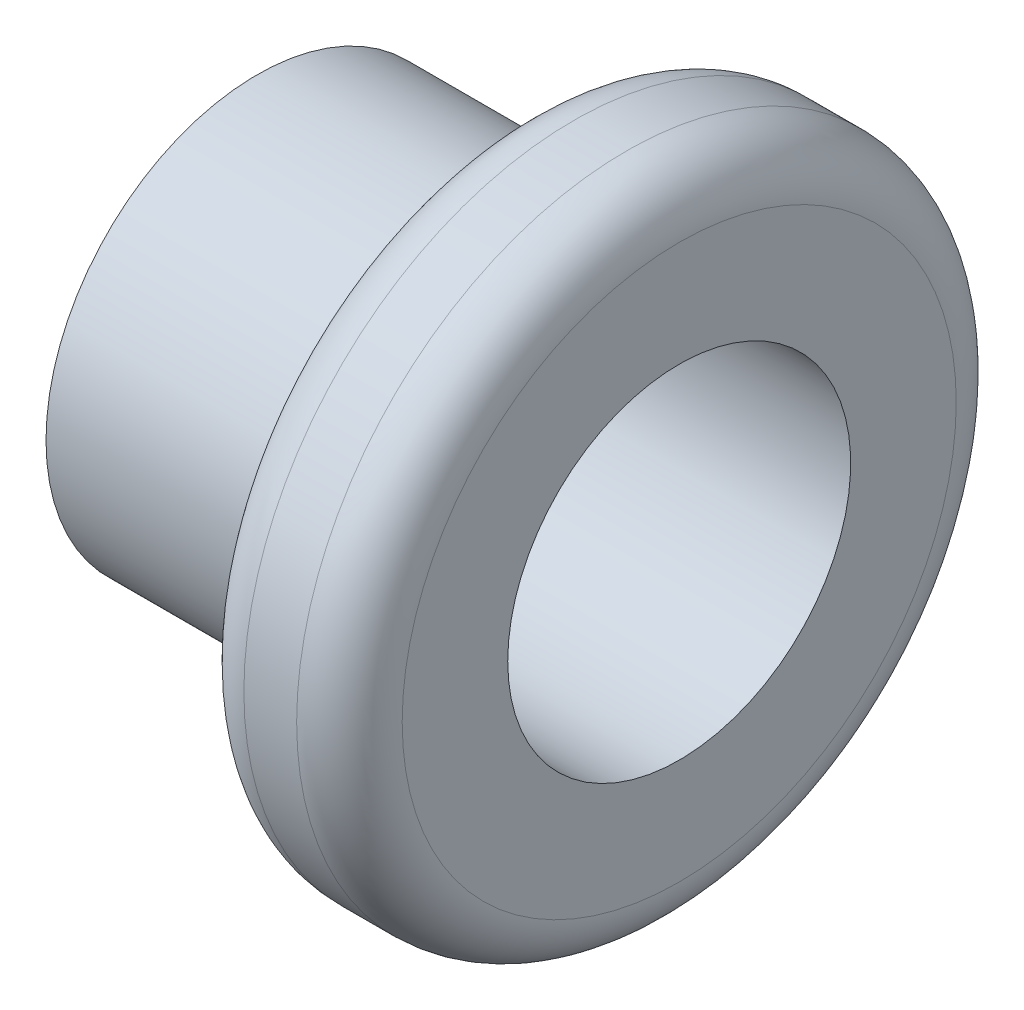
ISO-10303-21;
HEADER;
FILE_DESCRIPTION(('STEP AP214'),'2;1');
FILE_NAME('part.step','',(''),(''),'','','');
FILE_SCHEMA(('AUTOMOTIVE_DESIGN { 1 0 10303 214 1 1 1 1 }'));
ENDSEC;
DATA;
#1=APPLICATION_CONTEXT('core data for automotive mechanical design processes');
#2=APPLICATION_PROTOCOL_DEFINITION('international standard','automotive_design',2000,#1);
#3=PRODUCT_CONTEXT('',#1,'mechanical');
#4=PRODUCT('Part','Part','',(#3));
#5=PRODUCT_RELATED_PRODUCT_CATEGORY('part','',(#4));
#6=PRODUCT_DEFINITION_FORMATION('','',#4);
#7=PRODUCT_DEFINITION_CONTEXT('part definition',#1,'design');
#8=PRODUCT_DEFINITION('design','',#6,#7);
#9=PRODUCT_DEFINITION_SHAPE('','',#8);
#10=(LENGTH_UNIT() NAMED_UNIT(*) SI_UNIT(.MILLI.,.METRE.));
#11=(NAMED_UNIT(*) PLANE_ANGLE_UNIT() SI_UNIT($,.RADIAN.));
#12=(NAMED_UNIT(*) SI_UNIT($,.STERADIAN.) SOLID_ANGLE_UNIT());
#13=UNCERTAINTY_MEASURE_WITH_UNIT(LENGTH_MEASURE(1.E-05),#10,'distance_accuracy_value','');
#14=(GEOMETRIC_REPRESENTATION_CONTEXT(3) GLOBAL_UNCERTAINTY_ASSIGNED_CONTEXT((#13)) GLOBAL_UNIT_ASSIGNED_CONTEXT((#10,
#11,#12)) REPRESENTATION_CONTEXT('',''));
#15=CARTESIAN_POINT('',(0.,0.,0.));
#16=DIRECTION('',(0.,0.,1.));
#17=DIRECTION('',(1.,0.,0.));
#18=AXIS2_PLACEMENT_3D('',#15,#16,#17);
#19=CARTESIAN_POINT('',(12.,0.,0.));
#20=DIRECTION('',(-1.,0.,0.));
#21=DIRECTION('',(0.,0.,1.));
#22=AXIS2_PLACEMENT_3D('',#19,#20,#21);
#23=TOROIDAL_SURFACE('',#22,10.5,2.);
#24=CARTESIAN_POINT('',(10.,0.,0.));
#25=DIRECTION('',(1.,0.,0.));
#26=DIRECTION('',(0.,0.,1.));
#27=AXIS2_PLACEMENT_3D('',#24,#25,#26);
#28=CIRCLE('',#27,10.5);
#29=CARTESIAN_POINT('',(10.,0.,10.5));
#30=VERTEX_POINT('',#29);
#31=CARTESIAN_POINT('',(10.,0.,-10.5));
#32=VERTEX_POINT('',#31);
#33=EDGE_CURVE('E46',#30,#32,#28,.T.);
#34=ORIENTED_EDGE('',*,*,#33,.T.);
#35=CARTESIAN_POINT('',(10.,0.,0.));
#36=DIRECTION('',(1.,0.,0.));
#37=DIRECTION('',(0.,0.,-1.));
#38=AXIS2_PLACEMENT_3D('',#35,#36,#37);
#39=CIRCLE('',#38,10.5);
#40=EDGE_CURVE('E49',#32,#30,#39,.T.);
#41=ORIENTED_EDGE('',*,*,#40,.T.);
#42=EDGE_LOOP('',(#34,#41));
#43=FACE_BOUND('',#42,.T.);
#44=CARTESIAN_POINT('',(12.,0.,0.));
#45=DIRECTION('',(-1.,0.,0.));
#46=DIRECTION('',(0.,0.,1.));
#47=AXIS2_PLACEMENT_3D('',#44,#45,#46);
#48=CIRCLE('',#47,12.5);
#49=CARTESIAN_POINT('',(12.,0.,12.5));
#50=VERTEX_POINT('',#49);
#51=EDGE_CURVE('E55',#50,#50,#48,.F.);
#52=ORIENTED_EDGE('',*,*,#51,.F.);
#53=EDGE_LOOP('',(#52));
#54=FACE_BOUND('',#53,.T.);
#55=ADVANCED_FACE('F17',(#43,#54),#23,.T.);
#56=CARTESIAN_POINT('',(10.,8.,0.));
#57=DIRECTION('',(1.,0.,0.));
#58=DIRECTION('',(0.,0.,-1.));
#59=AXIS2_PLACEMENT_3D('',#56,#57,#58);
#60=PLANE('',#59);
#61=ORIENTED_EDGE('',*,*,#33,.F.);
#62=ORIENTED_EDGE('',*,*,#40,.F.);
#63=EDGE_LOOP('',(#61,#62));
#64=FACE_BOUND('',#63,.T.);
#65=CARTESIAN_POINT('',(10.,0.,0.));
#66=DIRECTION('',(-1.,0.,0.));
#67=DIRECTION('',(0.,0.,1.));
#68=AXIS2_PLACEMENT_3D('',#65,#66,#67);
#69=CIRCLE('',#68,8.);
#70=CARTESIAN_POINT('',(10.,0.,8.));
#71=VERTEX_POINT('',#70);
#72=EDGE_CURVE('E100',#71,#71,#69,.T.);
#73=ORIENTED_EDGE('',*,*,#72,.F.);
#74=EDGE_LOOP('',(#73));
#75=FACE_BOUND('',#74,.T.);
#76=ADVANCED_FACE('F51',(#64,#75),#60,.F.);
#77=CARTESIAN_POINT('',(0.,0.,0.));
#78=DIRECTION('',(-1.,0.,0.));
#79=DIRECTION('',(0.,0.,1.));
#80=AXIS2_PLACEMENT_3D('',#77,#78,#79);
#81=CYLINDRICAL_SURFACE('',#80,12.5);
#82=ORIENTED_EDGE('',*,*,#51,.T.);
#83=EDGE_LOOP('',(#82));
#84=FACE_BOUND('',#83,.T.);
#85=CARTESIAN_POINT('',(14.,0.,0.));
#86=DIRECTION('',(-1.,0.,0.));
#87=DIRECTION('',(0.,0.,1.));
#88=AXIS2_PLACEMENT_3D('',#85,#86,#87);
#89=CIRCLE('',#88,12.5);
#90=CARTESIAN_POINT('',(14.,0.,12.5));
#91=VERTEX_POINT('',#90);
#92=EDGE_CURVE('E92',#91,#91,#89,.F.);
#93=ORIENTED_EDGE('',*,*,#92,.F.);
#94=EDGE_LOOP('',(#93));
#95=FACE_BOUND('',#94,.T.);
#96=ADVANCED_FACE('F110',(#84,#95),#81,.T.);
#97=CARTESIAN_POINT('',(0.,0.,0.));
#98=DIRECTION('',(-1.,0.,0.));
#99=DIRECTION('',(0.,0.,1.));
#100=AXIS2_PLACEMENT_3D('',#97,#98,#99);
#101=CYLINDRICAL_SURFACE('',#100,8.);
#102=CARTESIAN_POINT('',(0.,0.,0.));
#103=DIRECTION('',(-1.,0.,0.));
#104=DIRECTION('',(0.,0.,1.));
#105=AXIS2_PLACEMENT_3D('',#102,#103,#104);
#106=CIRCLE('',#105,8.);
#107=CARTESIAN_POINT('',(0.,0.,8.));
#108=VERTEX_POINT('',#107);
#109=EDGE_CURVE('E99',#108,#108,#106,.F.);
#110=ORIENTED_EDGE('',*,*,#109,.T.);
#111=EDGE_LOOP('',(#110));
#112=FACE_BOUND('',#111,.T.);
#113=ORIENTED_EDGE('',*,*,#72,.T.);
#114=EDGE_LOOP('',(#113));
#115=FACE_BOUND('',#114,.T.);
#116=ADVANCED_FACE('F77',(#112,#115),#101,.T.);
#117=CARTESIAN_POINT('',(14.,0.,0.));
#118=DIRECTION('',(-1.,0.,0.));
#119=DIRECTION('',(0.,0.,1.));
#120=AXIS2_PLACEMENT_3D('',#117,#118,#119);
#121=TOROIDAL_SURFACE('',#120,10.5,2.);
#122=ORIENTED_EDGE('',*,*,#92,.T.);
#123=EDGE_LOOP('',(#122));
#124=FACE_BOUND('',#123,.T.);
#125=CARTESIAN_POINT('',(16.,0.,0.));
#126=DIRECTION('',(-1.,0.,0.));
#127=DIRECTION('',(0.,0.,1.));
#128=AXIS2_PLACEMENT_3D('',#125,#126,#127);
#129=CIRCLE('',#128,10.5);
#130=CARTESIAN_POINT('',(16.,0.,10.5));
#131=VERTEX_POINT('',#130);
#132=CARTESIAN_POINT('',(16.,0.,-10.5));
#133=VERTEX_POINT('',#132);
#134=EDGE_CURVE('E37',#131,#133,#129,.T.);
#135=ORIENTED_EDGE('',*,*,#134,.T.);
#136=CARTESIAN_POINT('',(16.,0.,0.));
#137=DIRECTION('',(-1.,0.,0.));
#138=DIRECTION('',(0.,0.,-1.));
#139=AXIS2_PLACEMENT_3D('',#136,#137,#138);
#140=CIRCLE('',#139,10.5);
#141=EDGE_CURVE('E134',#133,#131,#140,.T.);
#142=ORIENTED_EDGE('',*,*,#141,.T.);
#143=EDGE_LOOP('',(#135,#142));
#144=FACE_BOUND('',#143,.T.);
#145=ADVANCED_FACE('F65',(#124,#144),#121,.T.);
#146=CARTESIAN_POINT('',(0.,6.5,0.));
#147=DIRECTION('',(1.,0.,0.));
#148=DIRECTION('',(0.,0.,-1.));
#149=AXIS2_PLACEMENT_3D('',#146,#147,#148);
#150=PLANE('',#149);
#151=ORIENTED_EDGE('',*,*,#109,.F.);
#152=EDGE_LOOP('',(#151));
#153=FACE_BOUND('',#152,.T.);
#154=CARTESIAN_POINT('',(0.,0.,0.));
#155=DIRECTION('',(-1.,0.,0.));
#156=DIRECTION('',(0.,0.,1.));
#157=AXIS2_PLACEMENT_3D('',#154,#155,#156);
#158=CIRCLE('',#157,6.5);
#159=CARTESIAN_POINT('',(0.,0.,6.5));
#160=VERTEX_POINT('',#159);
#161=EDGE_CURVE('E29',#160,#160,#158,.F.);
#162=ORIENTED_EDGE('',*,*,#161,.T.);
#163=EDGE_LOOP('',(#162));
#164=FACE_BOUND('',#163,.T.);
#165=ADVANCED_FACE('F76',(#153,#164),#150,.F.);
#166=CARTESIAN_POINT('',(16.,6.5,0.));
#167=DIRECTION('',(-1.,0.,0.));
#168=DIRECTION('',(0.,0.,1.));
#169=AXIS2_PLACEMENT_3D('',#166,#167,#168);
#170=PLANE('',#169);
#171=CARTESIAN_POINT('',(16.,0.,0.));
#172=DIRECTION('',(-1.,0.,0.));
#173=DIRECTION('',(0.,0.,1.));
#174=AXIS2_PLACEMENT_3D('',#171,#172,#173);
#175=CIRCLE('',#174,6.5);
#176=CARTESIAN_POINT('',(16.,0.,6.5));
#177=VERTEX_POINT('',#176);
#178=EDGE_CURVE('E11',#177,#177,#175,.T.);
#179=ORIENTED_EDGE('',*,*,#178,.T.);
#180=EDGE_LOOP('',(#179));
#181=FACE_BOUND('',#180,.T.);
#182=ORIENTED_EDGE('',*,*,#141,.F.);
#183=ORIENTED_EDGE('',*,*,#134,.F.);
#184=EDGE_LOOP('',(#182,#183));
#185=FACE_BOUND('',#184,.T.);
#186=ADVANCED_FACE('F147',(#181,#185),#170,.F.);
#187=CARTESIAN_POINT('',(0.,0.,0.));
#188=DIRECTION('',(-1.,0.,0.));
#189=DIRECTION('',(0.,0.,1.));
#190=AXIS2_PLACEMENT_3D('',#187,#188,#189);
#191=CYLINDRICAL_SURFACE('',#190,6.5);
#192=ORIENTED_EDGE('',*,*,#161,.F.);
#193=EDGE_LOOP('',(#192));
#194=FACE_BOUND('',#193,.T.);
#195=ORIENTED_EDGE('',*,*,#178,.F.);
#196=EDGE_LOOP('',(#195));
#197=FACE_BOUND('',#196,.T.);
#198=ADVANCED_FACE('F145',(#194,#197),#191,.F.);
#199=CLOSED_SHELL('',(#55,#76,#96,#116,#145,#165,#186,#198));
#200=MANIFOLD_SOLID_BREP('B1',#199);
#201=ADVANCED_BREP_SHAPE_REPRESENTATION('',(#18,#200),#14);
#202=SHAPE_DEFINITION_REPRESENTATION(#9,#201);
ENDSEC;
END-ISO-10303-21;
